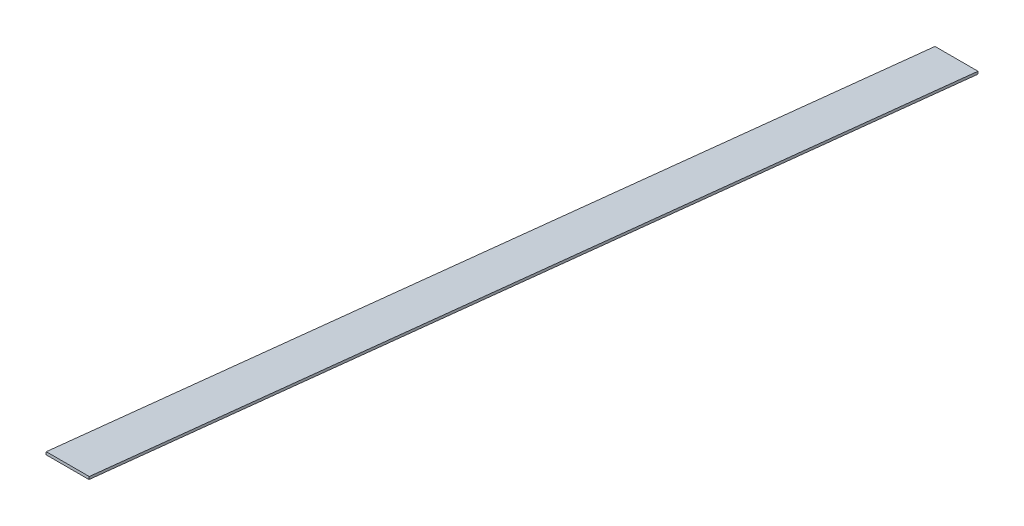
ISO-10303-21;
HEADER;
FILE_DESCRIPTION(('STEP AP214'),'2;1');
FILE_NAME('part.step','',(''),(''),'','','');
FILE_SCHEMA(('AUTOMOTIVE_DESIGN { 1 0 10303 214 1 1 1 1 }'));
ENDSEC;
DATA;
#1=APPLICATION_CONTEXT('core data for automotive mechanical design processes');
#2=APPLICATION_PROTOCOL_DEFINITION('international standard','automotive_design',2000,#1);
#3=PRODUCT_CONTEXT('',#1,'mechanical');
#4=PRODUCT('Part','Part','',(#3));
#5=PRODUCT_RELATED_PRODUCT_CATEGORY('part','',(#4));
#6=PRODUCT_DEFINITION_FORMATION('','',#4);
#7=PRODUCT_DEFINITION_CONTEXT('part definition',#1,'design');
#8=PRODUCT_DEFINITION('design','',#6,#7);
#9=PRODUCT_DEFINITION_SHAPE('','',#8);
#10=(LENGTH_UNIT() NAMED_UNIT(*) SI_UNIT(.MILLI.,.METRE.));
#11=(NAMED_UNIT(*) PLANE_ANGLE_UNIT() SI_UNIT($,.RADIAN.));
#12=(NAMED_UNIT(*) SI_UNIT($,.STERADIAN.) SOLID_ANGLE_UNIT());
#13=UNCERTAINTY_MEASURE_WITH_UNIT(LENGTH_MEASURE(1.E-05),#10,'distance_accuracy_value','');
#14=(GEOMETRIC_REPRESENTATION_CONTEXT(3) GLOBAL_UNCERTAINTY_ASSIGNED_CONTEXT((#13)) GLOBAL_UNIT_ASSIGNED_CONTEXT((#10,
#11,#12)) REPRESENTATION_CONTEXT('',''));
#15=CARTESIAN_POINT('',(0.,0.,0.));
#16=DIRECTION('',(0.,0.,1.));
#17=DIRECTION('',(1.,0.,0.));
#18=AXIS2_PLACEMENT_3D('',#15,#16,#17);
#19=CARTESIAN_POINT('',(56.8249999999999,-150.319090417385,-1387.55082695585));
#20=DIRECTION('',(1.,0.,0.));
#21=DIRECTION('',(0.,-0.104528463267647,-0.994521895368274));
#22=AXIS2_PLACEMENT_3D('',#19,#20,#21);
#23=PLANE('',#22);
#24=DIRECTION('',(0.,0.994521895368274,-0.104528463267647));
#25=VECTOR('',#24,1.);
#26=CARTESIAN_POINT('',(56.8249999999999,-79.5654599258556,-714.375));
#27=LINE('',#26,#25);
#28=CARTESIAN_POINT('',(56.8249999999999,-82.7230669436499,-714.043122129125));
#29=VERTEX_POINT('',#28);
#30=CARTESIAN_POINT('',(56.8249999999999,-79.5654599258556,-714.375));
#31=VERTEX_POINT('',#30);
#32=EDGE_CURVE('E11',#29,#31,#27,.T.);
#33=ORIENTED_EDGE('',*,*,#32,.F.);
#34=DIRECTION('',(0.,-0.104528463267647,-0.994521895368274));
#35=VECTOR('',#34,1.);
#36=CARTESIAN_POINT('',(56.8249999999999,-153.476697435179,-1387.21894908497));
#37=LINE('',#36,#35);
#38=CARTESIAN_POINT('',(56.8249999999999,-199.318851276045,-1823.37790809354));
#39=VERTEX_POINT('',#38);
#40=EDGE_CURVE('E99',#29,#39,#37,.T.);
#41=ORIENTED_EDGE('',*,*,#40,.T.);
#42=DIRECTION('',(0.,0.994521895368274,-0.104528463267647));
#43=VECTOR('',#42,1.);
#44=CARTESIAN_POINT('',(56.8249999999999,-196.16124425825,-1823.70978596441));
#45=LINE('',#44,#43);
#46=CARTESIAN_POINT('',(56.8249999999999,-196.16124425825,-1823.70978596441));
#47=VERTEX_POINT('',#46);
#48=EDGE_CURVE('E55',#39,#47,#45,.T.);
#49=ORIENTED_EDGE('',*,*,#48,.T.);
#50=DIRECTION('',(0.,-0.104528463267647,-0.994521895368274));
#51=VECTOR('',#50,1.);
#52=CARTESIAN_POINT('',(56.8249999999999,-150.319090417385,-1387.55082695585));
#53=LINE('',#52,#51);
#54=EDGE_CURVE('E112',#31,#47,#53,.T.);
#55=ORIENTED_EDGE('',*,*,#54,.F.);
#56=EDGE_LOOP('',(#33,#41,#49,#55));
#57=FACE_BOUND('',#56,.T.);
#58=ADVANCED_FACE('F45',(#57),#23,.T.);
#59=CARTESIAN_POINT('',(56.8249999999999,-196.16124425825,-1823.70978596441));
#60=DIRECTION('',(0.,0.104528463267647,0.994521895368274));
#61=DIRECTION('',(1.,0.,0.));
#62=AXIS2_PLACEMENT_3D('',#59,#60,#61);
#63=PLANE('',#62);
#64=ORIENTED_EDGE('',*,*,#48,.F.);
#65=DIRECTION('',(-1.,0.,0.));
#66=VECTOR('',#65,1.);
#67=CARTESIAN_POINT('',(1178.62031209504,-199.318851276045,-1823.37790809354));
#68=LINE('',#67,#66);
#69=CARTESIAN_POINT('',(3.17499999999993,-199.318851276045,-1823.37790809354));
#70=VERTEX_POINT('',#69);
#71=EDGE_CURVE('E106',#70,#39,#68,.F.);
#72=ORIENTED_EDGE('',*,*,#71,.F.);
#73=DIRECTION('',(0.,0.994521895368274,-0.104528463267647));
#74=VECTOR('',#73,1.);
#75=CARTESIAN_POINT('',(3.175,-196.16124425825,-1823.70978596441));
#76=LINE('',#75,#74);
#77=CARTESIAN_POINT('',(3.175,-196.16124425825,-1823.70978596441));
#78=VERTEX_POINT('',#77);
#79=EDGE_CURVE('E63',#70,#78,#76,.T.);
#80=ORIENTED_EDGE('',*,*,#79,.T.);
#81=DIRECTION('',(1.,0.,0.));
#82=VECTOR('',#81,1.);
#83=CARTESIAN_POINT('',(56.8249999999999,-196.16124425825,-1823.70978596441));
#84=LINE('',#83,#82);
#85=EDGE_CURVE('E93',#78,#47,#84,.T.);
#86=ORIENTED_EDGE('',*,*,#85,.T.);
#87=EDGE_LOOP('',(#64,#72,#80,#86));
#88=FACE_BOUND('',#87,.T.);
#89=ADVANCED_FACE('F116',(#88),#63,.F.);
#90=CARTESIAN_POINT('',(3.175,-150.319090417385,-1387.55082695585));
#91=DIRECTION('',(-1.,0.,0.));
#92=DIRECTION('',(0.,0.104528463267647,0.994521895368274));
#93=AXIS2_PLACEMENT_3D('',#90,#91,#92);
#94=PLANE('',#93);
#95=ORIENTED_EDGE('',*,*,#79,.F.);
#96=DIRECTION('',(0.,-0.104528463267647,-0.994521895368274));
#97=VECTOR('',#96,1.);
#98=CARTESIAN_POINT('',(3.17499999999993,-153.476697435179,-1387.21894908497));
#99=LINE('',#98,#97);
#100=CARTESIAN_POINT('',(3.17499999999993,-82.7230669436499,-714.043122129125));
#101=VERTEX_POINT('',#100);
#102=EDGE_CURVE('E98',#70,#101,#99,.F.);
#103=ORIENTED_EDGE('',*,*,#102,.T.);
#104=DIRECTION('',(0.,0.994521895368274,-0.104528463267647));
#105=VECTOR('',#104,1.);
#106=CARTESIAN_POINT('',(3.175,-79.5654599258556,-714.375));
#107=LINE('',#106,#105);
#108=CARTESIAN_POINT('',(3.175,-79.5654599258556,-714.375));
#109=VERTEX_POINT('',#108);
#110=EDGE_CURVE('E49',#101,#109,#107,.T.);
#111=ORIENTED_EDGE('',*,*,#110,.T.);
#112=DIRECTION('',(0.,0.104528463267647,0.994521895368274));
#113=VECTOR('',#112,1.);
#114=CARTESIAN_POINT('',(3.175,-150.319090417385,-1387.55082695585));
#115=LINE('',#114,#113);
#116=EDGE_CURVE('E108',#78,#109,#115,.T.);
#117=ORIENTED_EDGE('',*,*,#116,.F.);
#118=EDGE_LOOP('',(#95,#103,#111,#117));
#119=FACE_BOUND('',#118,.T.);
#120=ADVANCED_FACE('F101',(#119),#94,.T.);
#121=CARTESIAN_POINT('',(1178.62031209504,-79.5654599258556,-714.375));
#122=DIRECTION('',(0.,-0.104528463267647,-0.994521895368274));
#123=DIRECTION('',(-1.,0.,0.));
#124=AXIS2_PLACEMENT_3D('',#121,#122,#123);
#125=PLANE('',#124);
#126=DIRECTION('',(-1.,0.,0.));
#127=VECTOR('',#126,1.);
#128=CARTESIAN_POINT('',(1178.62031209504,-82.7230669436499,-714.043122129125));
#129=LINE('',#128,#127);
#130=EDGE_CURVE('E87',#29,#101,#129,.T.);
#131=ORIENTED_EDGE('',*,*,#130,.F.);
#132=ORIENTED_EDGE('',*,*,#32,.T.);
#133=DIRECTION('',(-1.,0.,0.));
#134=VECTOR('',#133,1.);
#135=CARTESIAN_POINT('',(1178.62031209504,-79.5654599258556,-714.375));
#136=LINE('',#135,#134);
#137=EDGE_CURVE('E89',#31,#109,#136,.T.);
#138=ORIENTED_EDGE('',*,*,#137,.T.);
#139=ORIENTED_EDGE('',*,*,#110,.F.);
#140=EDGE_LOOP('',(#131,#132,#138,#139));
#141=FACE_BOUND('',#140,.T.);
#142=ADVANCED_FACE('F47',(#141),#125,.F.);
#143=CARTESIAN_POINT('',(1178.62031209504,-150.319090417385,-1387.55082695585));
#144=DIRECTION('',(0.,0.994521895368274,-0.104528463267647));
#145=DIRECTION('',(0.,-0.104528463267647,-0.994521895368274));
#146=AXIS2_PLACEMENT_3D('',#143,#144,#145);
#147=PLANE('',#146);
#148=ORIENTED_EDGE('',*,*,#116,.T.);
#149=ORIENTED_EDGE('',*,*,#137,.F.);
#150=ORIENTED_EDGE('',*,*,#54,.T.);
#151=ORIENTED_EDGE('',*,*,#85,.F.);
#152=EDGE_LOOP('',(#148,#149,#150,#151));
#153=FACE_BOUND('',#152,.T.);
#154=ADVANCED_FACE('F115',(#153),#147,.T.);
#155=CARTESIAN_POINT('',(1178.62031209504,-153.476697435179,-1387.21894908497));
#156=DIRECTION('',(0.,0.994521895368274,-0.104528463267647));
#157=DIRECTION('',(0.,-0.104528463267647,-0.994521895368274));
#158=AXIS2_PLACEMENT_3D('',#155,#156,#157);
#159=PLANE('',#158);
#160=ORIENTED_EDGE('',*,*,#102,.F.);
#161=ORIENTED_EDGE('',*,*,#71,.T.);
#162=ORIENTED_EDGE('',*,*,#40,.F.);
#163=ORIENTED_EDGE('',*,*,#130,.T.);
#164=EDGE_LOOP('',(#160,#161,#162,#163));
#165=FACE_BOUND('',#164,.T.);
#166=ADVANCED_FACE('F96',(#165),#159,.F.);
#167=CLOSED_SHELL('',(#58,#89,#120,#142,#154,#166));
#168=MANIFOLD_SOLID_BREP('B2',#167);
#169=ADVANCED_BREP_SHAPE_REPRESENTATION('',(#18,#168),#14);
#170=SHAPE_DEFINITION_REPRESENTATION(#9,#169);
ENDSEC;
END-ISO-10303-21;
